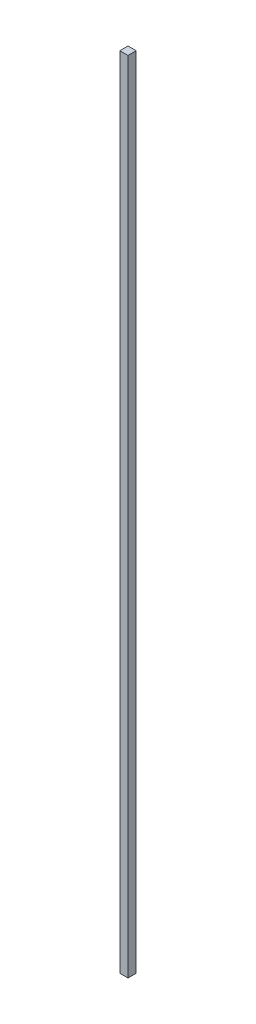
ISO-10303-21;
HEADER;
FILE_DESCRIPTION(('STEP AP214'),'2;1');
FILE_NAME('part.step','',(''),(''),'','','');
FILE_SCHEMA(('AUTOMOTIVE_DESIGN { 1 0 10303 214 1 1 1 1 }'));
ENDSEC;
DATA;
#1=APPLICATION_CONTEXT('core data for automotive mechanical design processes');
#2=APPLICATION_PROTOCOL_DEFINITION('international standard','automotive_design',2000,#1);
#3=PRODUCT_CONTEXT('',#1,'mechanical');
#4=PRODUCT('Part','Part','',(#3));
#5=PRODUCT_RELATED_PRODUCT_CATEGORY('part','',(#4));
#6=PRODUCT_DEFINITION_FORMATION('','',#4);
#7=PRODUCT_DEFINITION_CONTEXT('part definition',#1,'design');
#8=PRODUCT_DEFINITION('design','',#6,#7);
#9=PRODUCT_DEFINITION_SHAPE('','',#8);
#10=(LENGTH_UNIT() NAMED_UNIT(*) SI_UNIT(.MILLI.,.METRE.));
#11=(NAMED_UNIT(*) PLANE_ANGLE_UNIT() SI_UNIT($,.RADIAN.));
#12=(NAMED_UNIT(*) SI_UNIT($,.STERADIAN.) SOLID_ANGLE_UNIT());
#13=UNCERTAINTY_MEASURE_WITH_UNIT(LENGTH_MEASURE(1.E-05),#10,'distance_accuracy_value','');
#14=(GEOMETRIC_REPRESENTATION_CONTEXT(3) GLOBAL_UNCERTAINTY_ASSIGNED_CONTEXT((#13)) GLOBAL_UNIT_ASSIGNED_CONTEXT((#10,
#11,#12)) REPRESENTATION_CONTEXT('',''));
#15=CARTESIAN_POINT('',(0.,0.,0.));
#16=DIRECTION('',(0.,0.,1.));
#17=DIRECTION('',(1.,0.,0.));
#18=AXIS2_PLACEMENT_3D('',#15,#16,#17);
#19=CARTESIAN_POINT('',(1.5875,310.,-1.5875));
#20=DIRECTION('',(-1.,0.,0.));
#21=DIRECTION('',(0.,0.,1.));
#22=AXIS2_PLACEMENT_3D('',#19,#20,#21);
#23=PLANE('',#22);
#24=DIRECTION('',(0.,0.,-1.));
#25=VECTOR('',#24,1.);
#26=CARTESIAN_POINT('',(1.5875,0.,-1.5875));
#27=LINE('',#26,#25);
#28=CARTESIAN_POINT('',(1.5875,0.,1.5875));
#29=VERTEX_POINT('',#28);
#30=CARTESIAN_POINT('',(1.5875,0.,-1.5875));
#31=VERTEX_POINT('',#30);
#32=EDGE_CURVE('E105',#29,#31,#27,.T.);
#33=ORIENTED_EDGE('',*,*,#32,.T.);
#34=DIRECTION('',(0.,-1.,0.));
#35=VECTOR('',#34,1.);
#36=CARTESIAN_POINT('',(1.5875,310.,-1.5875));
#37=LINE('',#36,#35);
#38=CARTESIAN_POINT('',(1.5875,310.,-1.5875));
#39=VERTEX_POINT('',#38);
#40=EDGE_CURVE('E11',#39,#31,#37,.T.);
#41=ORIENTED_EDGE('',*,*,#40,.F.);
#42=DIRECTION('',(0.,0.,-1.));
#43=VECTOR('',#42,1.);
#44=CARTESIAN_POINT('',(1.5875,310.,-1.5875));
#45=LINE('',#44,#43);
#46=CARTESIAN_POINT('',(1.5875,310.,1.5875));
#47=VERTEX_POINT('',#46);
#48=EDGE_CURVE('E89',#47,#39,#45,.T.);
#49=ORIENTED_EDGE('',*,*,#48,.F.);
#50=DIRECTION('',(0.,-1.,0.));
#51=VECTOR('',#50,1.);
#52=CARTESIAN_POINT('',(1.5875,310.,1.5875));
#53=LINE('',#52,#51);
#54=EDGE_CURVE('E97',#47,#29,#53,.T.);
#55=ORIENTED_EDGE('',*,*,#54,.T.);
#56=EDGE_LOOP('',(#33,#41,#49,#55));
#57=FACE_BOUND('',#56,.T.);
#58=ADVANCED_FACE('F39',(#57),#23,.F.);
#59=CARTESIAN_POINT('',(-1.5875,310.,-1.5875));
#60=DIRECTION('',(0.,0.,1.));
#61=DIRECTION('',(1.,0.,0.));
#62=AXIS2_PLACEMENT_3D('',#59,#60,#61);
#63=PLANE('',#62);
#64=DIRECTION('',(-1.,0.,0.));
#65=VECTOR('',#64,1.);
#66=CARTESIAN_POINT('',(-1.5875,0.,-1.5875));
#67=LINE('',#66,#65);
#68=CARTESIAN_POINT('',(-1.5875,0.,-1.5875));
#69=VERTEX_POINT('',#68);
#70=EDGE_CURVE('E92',#31,#69,#67,.T.);
#71=ORIENTED_EDGE('',*,*,#70,.T.);
#72=DIRECTION('',(0.,-1.,0.));
#73=VECTOR('',#72,1.);
#74=CARTESIAN_POINT('',(-1.5875,310.,-1.5875));
#75=LINE('',#74,#73);
#76=CARTESIAN_POINT('',(-1.5875,310.,-1.5875));
#77=VERTEX_POINT('',#76);
#78=EDGE_CURVE('E50',#77,#69,#75,.T.);
#79=ORIENTED_EDGE('',*,*,#78,.F.);
#80=DIRECTION('',(-1.,0.,0.));
#81=VECTOR('',#80,1.);
#82=CARTESIAN_POINT('',(-1.5875,310.,-1.5875));
#83=LINE('',#82,#81);
#84=EDGE_CURVE('E82',#39,#77,#83,.T.);
#85=ORIENTED_EDGE('',*,*,#84,.F.);
#86=ORIENTED_EDGE('',*,*,#40,.T.);
#87=EDGE_LOOP('',(#71,#79,#85,#86));
#88=FACE_BOUND('',#87,.T.);
#89=ADVANCED_FACE('F93',(#88),#63,.F.);
#90=CARTESIAN_POINT('',(-1.5875,310.,-1.5875));
#91=DIRECTION('',(1.,0.,0.));
#92=DIRECTION('',(0.,0.,-1.));
#93=AXIS2_PLACEMENT_3D('',#90,#91,#92);
#94=PLANE('',#93);
#95=DIRECTION('',(0.,0.,1.));
#96=VECTOR('',#95,1.);
#97=CARTESIAN_POINT('',(-1.5875,0.,-1.5875));
#98=LINE('',#97,#96);
#99=CARTESIAN_POINT('',(-1.5875,0.,1.5875));
#100=VERTEX_POINT('',#99);
#101=EDGE_CURVE('E72',#69,#100,#98,.T.);
#102=ORIENTED_EDGE('',*,*,#101,.T.);
#103=DIRECTION('',(0.,-1.,0.));
#104=VECTOR('',#103,1.);
#105=CARTESIAN_POINT('',(-1.5875,310.,1.5875));
#106=LINE('',#105,#104);
#107=CARTESIAN_POINT('',(-1.5875,310.,1.5875));
#108=VERTEX_POINT('',#107);
#109=EDGE_CURVE('E94',#108,#100,#106,.T.);
#110=ORIENTED_EDGE('',*,*,#109,.F.);
#111=DIRECTION('',(0.,0.,1.));
#112=VECTOR('',#111,1.);
#113=CARTESIAN_POINT('',(-1.5875,310.,-1.5875));
#114=LINE('',#113,#112);
#115=EDGE_CURVE('E88',#77,#108,#114,.T.);
#116=ORIENTED_EDGE('',*,*,#115,.F.);
#117=ORIENTED_EDGE('',*,*,#78,.T.);
#118=EDGE_LOOP('',(#102,#110,#116,#117));
#119=FACE_BOUND('',#118,.T.);
#120=ADVANCED_FACE('F96',(#119),#94,.F.);
#121=CARTESIAN_POINT('',(-1.5875,310.,1.5875));
#122=DIRECTION('',(0.,0.,-1.));
#123=DIRECTION('',(-1.,0.,0.));
#124=AXIS2_PLACEMENT_3D('',#121,#122,#123);
#125=PLANE('',#124);
#126=DIRECTION('',(1.,0.,0.));
#127=VECTOR('',#126,1.);
#128=CARTESIAN_POINT('',(-1.5875,0.,1.5875));
#129=LINE('',#128,#127);
#130=EDGE_CURVE('E76',#100,#29,#129,.T.);
#131=ORIENTED_EDGE('',*,*,#130,.T.);
#132=ORIENTED_EDGE('',*,*,#54,.F.);
#133=DIRECTION('',(1.,0.,0.));
#134=VECTOR('',#133,1.);
#135=CARTESIAN_POINT('',(-1.5875,310.,1.5875));
#136=LINE('',#135,#134);
#137=EDGE_CURVE('E54',#108,#47,#136,.T.);
#138=ORIENTED_EDGE('',*,*,#137,.F.);
#139=ORIENTED_EDGE('',*,*,#109,.T.);
#140=EDGE_LOOP('',(#131,#132,#138,#139));
#141=FACE_BOUND('',#140,.T.);
#142=ADVANCED_FACE('F108',(#141),#125,.F.);
#143=CARTESIAN_POINT('',(0.,310.,0.));
#144=DIRECTION('',(0.,1.,0.));
#145=DIRECTION('',(0.,0.,1.));
#146=AXIS2_PLACEMENT_3D('',#143,#144,#145);
#147=PLANE('',#146);
#148=ORIENTED_EDGE('',*,*,#48,.T.);
#149=ORIENTED_EDGE('',*,*,#84,.T.);
#150=ORIENTED_EDGE('',*,*,#115,.T.);
#151=ORIENTED_EDGE('',*,*,#137,.T.);
#152=EDGE_LOOP('',(#148,#149,#150,#151));
#153=FACE_BOUND('',#152,.T.);
#154=ADVANCED_FACE('F86',(#153),#147,.T.);
#155=CARTESIAN_POINT('',(0.,0.,0.));
#156=DIRECTION('',(0.,1.,0.));
#157=DIRECTION('',(0.,0.,1.));
#158=AXIS2_PLACEMENT_3D('',#155,#156,#157);
#159=PLANE('',#158);
#160=ORIENTED_EDGE('',*,*,#32,.F.);
#161=ORIENTED_EDGE('',*,*,#130,.F.);
#162=ORIENTED_EDGE('',*,*,#101,.F.);
#163=ORIENTED_EDGE('',*,*,#70,.F.);
#164=EDGE_LOOP('',(#160,#161,#162,#163));
#165=FACE_BOUND('',#164,.T.);
#166=ADVANCED_FACE('F115',(#165),#159,.F.);
#167=CLOSED_SHELL('',(#58,#89,#120,#142,#154,#166));
#168=MANIFOLD_SOLID_BREP('B2',#167);
#169=ADVANCED_BREP_SHAPE_REPRESENTATION('',(#18,#168),#14);
#170=SHAPE_DEFINITION_REPRESENTATION(#9,#169);
ENDSEC;
END-ISO-10303-21;
